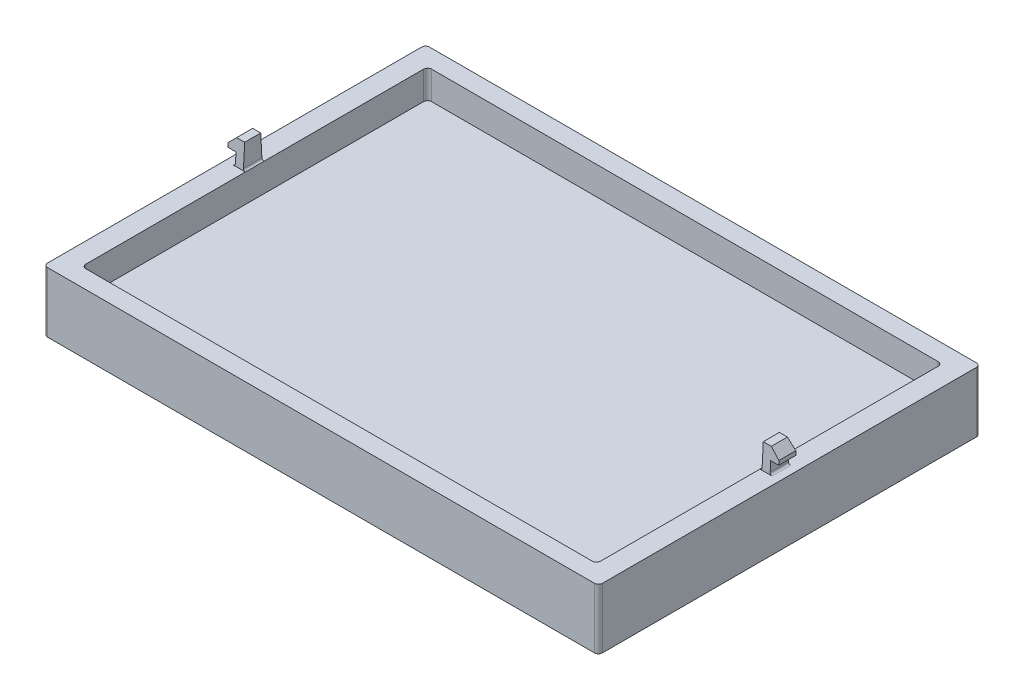
ISO-10303-21;
HEADER;
FILE_DESCRIPTION(('STEP AP214'),'2;1');
FILE_NAME('part.step','',(''),(''),'','','');
FILE_SCHEMA(('AUTOMOTIVE_DESIGN { 1 0 10303 214 1 1 1 1 }'));
ENDSEC;
DATA;
#1=APPLICATION_CONTEXT('core data for automotive mechanical design processes');
#2=APPLICATION_PROTOCOL_DEFINITION('international standard','automotive_design',2000,#1);
#3=PRODUCT_CONTEXT('',#1,'mechanical');
#4=PRODUCT('Part','Part','',(#3));
#5=PRODUCT_RELATED_PRODUCT_CATEGORY('part','',(#4));
#6=PRODUCT_DEFINITION_FORMATION('','',#4);
#7=PRODUCT_DEFINITION_CONTEXT('part definition',#1,'design');
#8=PRODUCT_DEFINITION('design','',#6,#7);
#9=PRODUCT_DEFINITION_SHAPE('','',#8);
#10=(LENGTH_UNIT() NAMED_UNIT(*) SI_UNIT(.MILLI.,.METRE.));
#11=(NAMED_UNIT(*) PLANE_ANGLE_UNIT() SI_UNIT($,.RADIAN.));
#12=(NAMED_UNIT(*) SI_UNIT($,.STERADIAN.) SOLID_ANGLE_UNIT());
#13=UNCERTAINTY_MEASURE_WITH_UNIT(LENGTH_MEASURE(1.E-05),#10,'distance_accuracy_value','');
#14=(GEOMETRIC_REPRESENTATION_CONTEXT(3) GLOBAL_UNCERTAINTY_ASSIGNED_CONTEXT((#13)) GLOBAL_UNIT_ASSIGNED_CONTEXT((#10,
#11,#12)) REPRESENTATION_CONTEXT('',''));
#15=CARTESIAN_POINT('',(0.,0.,0.));
#16=DIRECTION('',(0.,0.,1.));
#17=DIRECTION('',(1.,0.,0.));
#18=AXIS2_PLACEMENT_3D('',#15,#16,#17);
#19=CARTESIAN_POINT('',(-69.,15.,-47.5));
#20=DIRECTION('',(1.,0.,0.));
#21=DIRECTION('',(0.,0.,-1.));
#22=AXIS2_PLACEMENT_3D('',#19,#20,#21);
#23=PLANE('',#22);
#24=DIRECTION('',(0.,0.,1.));
#25=VECTOR('',#24,1.);
#26=CARTESIAN_POINT('',(-69.,15.,-47.5));
#27=LINE('',#26,#25);
#28=CARTESIAN_POINT('',(-69.,15.,-46.5));
#29=VERTEX_POINT('',#28);
#30=CARTESIAN_POINT('',(-69.,15.,46.5));
#31=VERTEX_POINT('',#30);
#32=EDGE_CURVE('E381',#29,#31,#27,.T.);
#33=ORIENTED_EDGE('',*,*,#32,.F.);
#34=DIRECTION('',(0.,-1.,0.));
#35=VECTOR('',#34,1.);
#36=CARTESIAN_POINT('',(-69.,0.,-46.5));
#37=LINE('',#36,#35);
#38=CARTESIAN_POINT('',(-69.,0.,-46.5));
#39=VERTEX_POINT('',#38);
#40=EDGE_CURVE('E465',#29,#39,#37,.T.);
#41=ORIENTED_EDGE('',*,*,#40,.T.);
#42=DIRECTION('',(0.,0.,1.));
#43=VECTOR('',#42,1.);
#44=CARTESIAN_POINT('',(-69.,0.,-47.5));
#45=LINE('',#44,#43);
#46=CARTESIAN_POINT('',(-69.,0.,46.5));
#47=VERTEX_POINT('',#46);
#48=EDGE_CURVE('E366',#39,#47,#45,.T.);
#49=ORIENTED_EDGE('',*,*,#48,.T.);
#50=DIRECTION('',(0.,-1.,0.));
#51=VECTOR('',#50,1.);
#52=CARTESIAN_POINT('',(-69.,15.,46.5));
#53=LINE('',#52,#51);
#54=EDGE_CURVE('E463',#47,#31,#53,.F.);
#55=ORIENTED_EDGE('',*,*,#54,.T.);
#56=EDGE_LOOP('',(#33,#41,#49,#55));
#57=FACE_BOUND('',#56,.T.);
#58=ADVANCED_FACE('F34',(#57),#23,.F.);
#59=CARTESIAN_POINT('',(-69.,15.,47.5));
#60=DIRECTION('',(0.,0.,-1.));
#61=DIRECTION('',(-1.,0.,0.));
#62=AXIS2_PLACEMENT_3D('',#59,#60,#61);
#63=PLANE('',#62);
#64=DIRECTION('',(1.,0.,0.));
#65=VECTOR('',#64,1.);
#66=CARTESIAN_POINT('',(-69.,0.,47.5));
#67=LINE('',#66,#65);
#68=CARTESIAN_POINT('',(-68.,0.,47.5));
#69=VERTEX_POINT('',#68);
#70=CARTESIAN_POINT('',(68.,0.,47.5));
#71=VERTEX_POINT('',#70);
#72=EDGE_CURVE('E397',#69,#71,#67,.T.);
#73=ORIENTED_EDGE('',*,*,#72,.T.);
#74=DIRECTION('',(0.,-1.,0.));
#75=VECTOR('',#74,1.);
#76=CARTESIAN_POINT('',(68.,15.,47.5));
#77=LINE('',#76,#75);
#78=CARTESIAN_POINT('',(68.,15.,47.5));
#79=VERTEX_POINT('',#78);
#80=EDGE_CURVE('E448',#71,#79,#77,.F.);
#81=ORIENTED_EDGE('',*,*,#80,.T.);
#82=DIRECTION('',(1.,0.,0.));
#83=VECTOR('',#82,1.);
#84=CARTESIAN_POINT('',(-69.,15.,47.5));
#85=LINE('',#84,#83);
#86=CARTESIAN_POINT('',(-68.,15.,47.5));
#87=VERTEX_POINT('',#86);
#88=EDGE_CURVE('E384',#87,#79,#85,.T.);
#89=ORIENTED_EDGE('',*,*,#88,.F.);
#90=DIRECTION('',(0.,-1.,0.));
#91=VECTOR('',#90,1.);
#92=CARTESIAN_POINT('',(-68.,15.,47.5));
#93=LINE('',#92,#91);
#94=EDGE_CURVE('E445',#87,#69,#93,.T.);
#95=ORIENTED_EDGE('',*,*,#94,.T.);
#96=EDGE_LOOP('',(#73,#81,#89,#95));
#97=FACE_BOUND('',#96,.T.);
#98=ADVANCED_FACE('F605',(#97),#63,.F.);
#99=CARTESIAN_POINT('',(69.,15.,-47.5));
#100=DIRECTION('',(1.,0.,0.));
#101=DIRECTION('',(0.,0.,-1.));
#102=AXIS2_PLACEMENT_3D('',#99,#100,#101);
#103=PLANE('',#102);
#104=DIRECTION('',(0.,0.,1.));
#105=VECTOR('',#104,1.);
#106=CARTESIAN_POINT('',(69.,15.,-47.5));
#107=LINE('',#106,#105);
#108=CARTESIAN_POINT('',(69.,15.,-46.5));
#109=VERTEX_POINT('',#108);
#110=CARTESIAN_POINT('',(69.,15.,46.5));
#111=VERTEX_POINT('',#110);
#112=EDGE_CURVE('E388',#109,#111,#107,.T.);
#113=ORIENTED_EDGE('',*,*,#112,.T.);
#114=DIRECTION('',(0.,-1.,0.));
#115=VECTOR('',#114,1.);
#116=CARTESIAN_POINT('',(69.,0.,46.5));
#117=LINE('',#116,#115);
#118=CARTESIAN_POINT('',(69.,0.,46.5));
#119=VERTEX_POINT('',#118);
#120=EDGE_CURVE('E434',#111,#119,#117,.T.);
#121=ORIENTED_EDGE('',*,*,#120,.T.);
#122=DIRECTION('',(0.,0.,1.));
#123=VECTOR('',#122,1.);
#124=CARTESIAN_POINT('',(69.,0.,-47.5));
#125=LINE('',#124,#123);
#126=CARTESIAN_POINT('',(69.,0.,-46.5));
#127=VERTEX_POINT('',#126);
#128=EDGE_CURVE('E400',#127,#119,#125,.T.);
#129=ORIENTED_EDGE('',*,*,#128,.F.);
#130=DIRECTION('',(0.,-1.,0.));
#131=VECTOR('',#130,1.);
#132=CARTESIAN_POINT('',(69.,15.,-46.5));
#133=LINE('',#132,#131);
#134=EDGE_CURVE('E432',#127,#109,#133,.F.);
#135=ORIENTED_EDGE('',*,*,#134,.T.);
#136=EDGE_LOOP('',(#113,#121,#129,#135));
#137=FACE_BOUND('',#136,.T.);
#138=ADVANCED_FACE('F611',(#137),#103,.T.);
#139=CARTESIAN_POINT('',(-69.,15.,-47.5));
#140=DIRECTION('',(0.,0.,-1.));
#141=DIRECTION('',(-1.,0.,0.));
#142=AXIS2_PLACEMENT_3D('',#139,#140,#141);
#143=PLANE('',#142);
#144=DIRECTION('',(1.,0.,0.));
#145=VECTOR('',#144,1.);
#146=CARTESIAN_POINT('',(-69.,15.,-47.5));
#147=LINE('',#146,#145);
#148=CARTESIAN_POINT('',(-68.,15.,-47.5));
#149=VERTEX_POINT('',#148);
#150=CARTESIAN_POINT('',(68.,15.,-47.5));
#151=VERTEX_POINT('',#150);
#152=EDGE_CURVE('E391',#149,#151,#147,.T.);
#153=ORIENTED_EDGE('',*,*,#152,.T.);
#154=DIRECTION('',(0.,-1.,0.));
#155=VECTOR('',#154,1.);
#156=CARTESIAN_POINT('',(68.,15.,-47.5));
#157=LINE('',#156,#155);
#158=CARTESIAN_POINT('',(68.,0.,-47.5));
#159=VERTEX_POINT('',#158);
#160=EDGE_CURVE('E460',#151,#159,#157,.T.);
#161=ORIENTED_EDGE('',*,*,#160,.T.);
#162=DIRECTION('',(1.,0.,0.));
#163=VECTOR('',#162,1.);
#164=CARTESIAN_POINT('',(-69.,0.,-47.5));
#165=LINE('',#164,#163);
#166=CARTESIAN_POINT('',(-68.,0.,-47.5));
#167=VERTEX_POINT('',#166);
#168=EDGE_CURVE('E385',#167,#159,#165,.T.);
#169=ORIENTED_EDGE('',*,*,#168,.F.);
#170=DIRECTION('',(0.,-1.,0.));
#171=VECTOR('',#170,1.);
#172=CARTESIAN_POINT('',(-68.,15.,-47.5));
#173=LINE('',#172,#171);
#174=EDGE_CURVE('E458',#167,#149,#173,.F.);
#175=ORIENTED_EDGE('',*,*,#174,.T.);
#176=EDGE_LOOP('',(#153,#161,#169,#175));
#177=FACE_BOUND('',#176,.T.);
#178=ADVANCED_FACE('F708',(#177),#143,.T.);
#179=CARTESIAN_POINT('',(0.,15.,0.));
#180=DIRECTION('',(0.,1.,0.));
#181=DIRECTION('',(0.,0.,1.));
#182=AXIS2_PLACEMENT_3D('',#179,#180,#181);
#183=PLANE('',#182);
#184=DIRECTION('',(0.,0.,1.));
#185=VECTOR('',#184,1.);
#186=CARTESIAN_POINT('',(-64.,15.,-43.));
#187=LINE('',#186,#185);
#188=CARTESIAN_POINT('',(-64.,15.,2.31444667569825));
#189=VERTEX_POINT('',#188);
#190=CARTESIAN_POINT('',(-64.,15.,42.));
#191=VERTEX_POINT('',#190);
#192=EDGE_CURVE('E374',#189,#191,#187,.T.);
#193=ORIENTED_EDGE('',*,*,#192,.F.);
#194=DIRECTION('',(-1.,0.,0.));
#195=VECTOR('',#194,1.);
#196=CARTESIAN_POINT('',(-64.5,15.,2.31444667569824));
#197=LINE('',#196,#195);
#198=CARTESIAN_POINT('',(-67.,15.,2.31444667569824));
#199=VERTEX_POINT('',#198);
#200=EDGE_CURVE('E295',#189,#199,#197,.T.);
#201=ORIENTED_EDGE('',*,*,#200,.T.);
#202=DIRECTION('',(0.,0.,-1.));
#203=VECTOR('',#202,1.);
#204=CARTESIAN_POINT('',(-67.,15.,-2.31444667569825));
#205=LINE('',#204,#203);
#206=CARTESIAN_POINT('',(-67.,15.,-2.31444667569825));
#207=VERTEX_POINT('',#206);
#208=EDGE_CURVE('E481',#199,#207,#205,.T.);
#209=ORIENTED_EDGE('',*,*,#208,.T.);
#210=DIRECTION('',(1.,0.,0.));
#211=VECTOR('',#210,1.);
#212=CARTESIAN_POINT('',(-64.5,15.,-2.31444667569825));
#213=LINE('',#212,#211);
#214=CARTESIAN_POINT('',(-64.,15.,-2.31444667569825));
#215=VERTEX_POINT('',#214);
#216=EDGE_CURVE('E274',#207,#215,#213,.T.);
#217=ORIENTED_EDGE('',*,*,#216,.T.);
#218=CARTESIAN_POINT('',(-64.,15.,-42.));
#219=VERTEX_POINT('',#218);
#220=EDGE_CURVE('E375',#219,#215,#187,.T.);
#221=ORIENTED_EDGE('',*,*,#220,.F.);
#222=CARTESIAN_POINT('',(-63.,15.,-42.));
#223=DIRECTION('',(0.,1.,0.));
#224=DIRECTION('',(0.,0.,1.));
#225=AXIS2_PLACEMENT_3D('',#222,#223,#224);
#226=CIRCLE('',#225,1.);
#227=CARTESIAN_POINT('',(-63.,15.,-43.));
#228=VERTEX_POINT('',#227);
#229=EDGE_CURVE('E471',#219,#228,#226,.F.);
#230=ORIENTED_EDGE('',*,*,#229,.T.);
#231=DIRECTION('',(-1.,0.,0.));
#232=VECTOR('',#231,1.);
#233=CARTESIAN_POINT('',(-64.,15.,-43.));
#234=LINE('',#233,#232);
#235=CARTESIAN_POINT('',(63.,15.,-43.));
#236=VERTEX_POINT('',#235);
#237=EDGE_CURVE('E370',#236,#228,#234,.T.);
#238=ORIENTED_EDGE('',*,*,#237,.F.);
#239=CARTESIAN_POINT('',(63.,15.,-42.));
#240=DIRECTION('',(0.,1.,0.));
#241=DIRECTION('',(0.,0.,1.));
#242=AXIS2_PLACEMENT_3D('',#239,#240,#241);
#243=CIRCLE('',#242,1.);
#244=CARTESIAN_POINT('',(64.,15.,-42.));
#245=VERTEX_POINT('',#244);
#246=EDGE_CURVE('E473',#236,#245,#243,.F.);
#247=ORIENTED_EDGE('',*,*,#246,.T.);
#248=DIRECTION('',(0.,0.,-1.));
#249=VECTOR('',#248,1.);
#250=CARTESIAN_POINT('',(64.,15.,-43.));
#251=LINE('',#250,#249);
#252=CARTESIAN_POINT('',(64.,15.,-2.31444667569825));
#253=VERTEX_POINT('',#252);
#254=EDGE_CURVE('E309',#253,#245,#251,.T.);
#255=ORIENTED_EDGE('',*,*,#254,.F.);
#256=DIRECTION('',(1.,0.,0.));
#257=VECTOR('',#256,1.);
#258=CARTESIAN_POINT('',(64.5,15.,-2.31444667569825));
#259=LINE('',#258,#257);
#260=CARTESIAN_POINT('',(67.,15.,-2.31444667569825));
#261=VERTEX_POINT('',#260);
#262=EDGE_CURVE('E307',#253,#261,#259,.T.);
#263=ORIENTED_EDGE('',*,*,#262,.T.);
#264=DIRECTION('',(0.,0.,1.));
#265=VECTOR('',#264,1.);
#266=CARTESIAN_POINT('',(67.,15.,2.31444667569824));
#267=LINE('',#266,#265);
#268=CARTESIAN_POINT('',(67.,15.,2.31444667569824));
#269=VERTEX_POINT('',#268);
#270=EDGE_CURVE('E478',#261,#269,#267,.T.);
#271=ORIENTED_EDGE('',*,*,#270,.T.);
#272=DIRECTION('',(-1.,0.,0.));
#273=VECTOR('',#272,1.);
#274=CARTESIAN_POINT('',(64.5,15.,2.31444667569824));
#275=LINE('',#274,#273);
#276=CARTESIAN_POINT('',(64.,15.,2.31444667569825));
#277=VERTEX_POINT('',#276);
#278=EDGE_CURVE('E310',#269,#277,#275,.T.);
#279=ORIENTED_EDGE('',*,*,#278,.T.);
#280=CARTESIAN_POINT('',(64.,15.,42.));
#281=VERTEX_POINT('',#280);
#282=EDGE_CURVE('E367',#281,#277,#251,.T.);
#283=ORIENTED_EDGE('',*,*,#282,.F.);
#284=CARTESIAN_POINT('',(63.,15.,42.));
#285=DIRECTION('',(0.,1.,0.));
#286=DIRECTION('',(0.,0.,1.));
#287=AXIS2_PLACEMENT_3D('',#284,#285,#286);
#288=CIRCLE('',#287,1.);
#289=CARTESIAN_POINT('',(63.,15.,43.));
#290=VERTEX_POINT('',#289);
#291=EDGE_CURVE('E476',#281,#290,#288,.F.);
#292=ORIENTED_EDGE('',*,*,#291,.T.);
#293=DIRECTION('',(1.,0.,0.));
#294=VECTOR('',#293,1.);
#295=CARTESIAN_POINT('',(-64.,15.,43.));
#296=LINE('',#295,#294);
#297=CARTESIAN_POINT('',(-63.,15.,43.));
#298=VERTEX_POINT('',#297);
#299=EDGE_CURVE('E357',#298,#290,#296,.T.);
#300=ORIENTED_EDGE('',*,*,#299,.F.);
#301=CARTESIAN_POINT('',(-63.,15.,42.));
#302=DIRECTION('',(0.,1.,0.));
#303=DIRECTION('',(0.,0.,1.));
#304=AXIS2_PLACEMENT_3D('',#301,#302,#303);
#305=CIRCLE('',#304,1.);
#306=EDGE_CURVE('E468',#298,#191,#305,.F.);
#307=ORIENTED_EDGE('',*,*,#306,.T.);
#308=EDGE_LOOP('',(#193,#201,#209,#217,#221,#230,#238,#247,#255,#263,#271,#279,#283,#292,#300,#307));
#309=FACE_BOUND('',#308,.T.);
#310=ORIENTED_EDGE('',*,*,#88,.T.);
#311=CARTESIAN_POINT('',(68.,15.,46.5));
#312=DIRECTION('',(0.,1.,0.));
#313=DIRECTION('',(0.,0.,1.));
#314=AXIS2_PLACEMENT_3D('',#311,#312,#313);
#315=CIRCLE('',#314,1.);
#316=EDGE_CURVE('E456',#79,#111,#315,.T.);
#317=ORIENTED_EDGE('',*,*,#316,.T.);
#318=ORIENTED_EDGE('',*,*,#112,.F.);
#319=CARTESIAN_POINT('',(68.,15.,-46.5));
#320=DIRECTION('',(0.,1.,0.));
#321=DIRECTION('',(0.,0.,1.));
#322=AXIS2_PLACEMENT_3D('',#319,#320,#321);
#323=CIRCLE('',#322,1.);
#324=EDGE_CURVE('E454',#109,#151,#323,.T.);
#325=ORIENTED_EDGE('',*,*,#324,.T.);
#326=ORIENTED_EDGE('',*,*,#152,.F.);
#327=CARTESIAN_POINT('',(-68.,15.,-46.5));
#328=DIRECTION('',(0.,1.,0.));
#329=DIRECTION('',(0.,0.,1.));
#330=AXIS2_PLACEMENT_3D('',#327,#328,#329);
#331=CIRCLE('',#330,1.);
#332=EDGE_CURVE('E452',#149,#29,#331,.T.);
#333=ORIENTED_EDGE('',*,*,#332,.T.);
#334=ORIENTED_EDGE('',*,*,#32,.T.);
#335=CARTESIAN_POINT('',(-68.,15.,46.5));
#336=DIRECTION('',(0.,1.,0.));
#337=DIRECTION('',(0.,0.,1.));
#338=AXIS2_PLACEMENT_3D('',#335,#336,#337);
#339=CIRCLE('',#338,1.);
#340=EDGE_CURVE('E450',#31,#87,#339,.T.);
#341=ORIENTED_EDGE('',*,*,#340,.T.);
#342=EDGE_LOOP('',(#310,#317,#318,#325,#326,#333,#334,#341));
#343=FACE_BOUND('',#342,.T.);
#344=ADVANCED_FACE('F524',(#309,#343),#183,.T.);
#345=CARTESIAN_POINT('',(0.,0.,0.));
#346=DIRECTION('',(0.,1.,0.));
#347=DIRECTION('',(0.,0.,1.));
#348=AXIS2_PLACEMENT_3D('',#345,#346,#347);
#349=PLANE('',#348);
#350=ORIENTED_EDGE('',*,*,#128,.T.);
#351=CARTESIAN_POINT('',(68.,0.,46.5));
#352=DIRECTION('',(0.,1.,0.));
#353=DIRECTION('',(0.,0.,1.));
#354=AXIS2_PLACEMENT_3D('',#351,#352,#353);
#355=CIRCLE('',#354,1.);
#356=EDGE_CURVE('E443',#119,#71,#355,.F.);
#357=ORIENTED_EDGE('',*,*,#356,.T.);
#358=ORIENTED_EDGE('',*,*,#72,.F.);
#359=CARTESIAN_POINT('',(-68.,0.,46.5));
#360=DIRECTION('',(0.,1.,0.));
#361=DIRECTION('',(0.,0.,1.));
#362=AXIS2_PLACEMENT_3D('',#359,#360,#361);
#363=CIRCLE('',#362,1.);
#364=EDGE_CURVE('E437',#69,#47,#363,.F.);
#365=ORIENTED_EDGE('',*,*,#364,.T.);
#366=ORIENTED_EDGE('',*,*,#48,.F.);
#367=CARTESIAN_POINT('',(-68.,0.,-46.5));
#368=DIRECTION('',(0.,1.,0.));
#369=DIRECTION('',(0.,0.,1.));
#370=AXIS2_PLACEMENT_3D('',#367,#368,#369);
#371=CIRCLE('',#370,1.);
#372=EDGE_CURVE('E439',#39,#167,#371,.F.);
#373=ORIENTED_EDGE('',*,*,#372,.T.);
#374=ORIENTED_EDGE('',*,*,#168,.T.);
#375=CARTESIAN_POINT('',(68.,0.,-46.5));
#376=DIRECTION('',(0.,1.,0.));
#377=DIRECTION('',(0.,0.,1.));
#378=AXIS2_PLACEMENT_3D('',#375,#376,#377);
#379=CIRCLE('',#378,1.);
#380=EDGE_CURVE('E441',#159,#127,#379,.F.);
#381=ORIENTED_EDGE('',*,*,#380,.T.);
#382=EDGE_LOOP('',(#350,#357,#358,#365,#366,#373,#374,#381));
#383=FACE_BOUND('',#382,.T.);
#384=ADVANCED_FACE('F705',(#383),#349,.F.);
#385=CARTESIAN_POINT('',(64.,8.,-43.));
#386=DIRECTION('',(1.,0.,0.));
#387=DIRECTION('',(0.,0.,-1.));
#388=AXIS2_PLACEMENT_3D('',#385,#386,#387);
#389=PLANE('',#388);
#390=ORIENTED_EDGE('',*,*,#282,.T.);
#391=EDGE_CURVE('E371',#277,#253,#251,.T.);
#392=ORIENTED_EDGE('',*,*,#391,.T.);
#393=ORIENTED_EDGE('',*,*,#254,.T.);
#394=DIRECTION('',(0.,1.,0.));
#395=VECTOR('',#394,1.);
#396=CARTESIAN_POINT('',(64.,8.,-42.));
#397=LINE('',#396,#395);
#398=CARTESIAN_POINT('',(64.,8.,-42.));
#399=VERTEX_POINT('',#398);
#400=EDGE_CURVE('E430',#245,#399,#397,.F.);
#401=ORIENTED_EDGE('',*,*,#400,.T.);
#402=DIRECTION('',(0.,0.,-1.));
#403=VECTOR('',#402,1.);
#404=CARTESIAN_POINT('',(64.,8.,-43.));
#405=LINE('',#404,#403);
#406=CARTESIAN_POINT('',(64.,8.,42.));
#407=VERTEX_POINT('',#406);
#408=EDGE_CURVE('E353',#407,#399,#405,.T.);
#409=ORIENTED_EDGE('',*,*,#408,.F.);
#410=DIRECTION('',(0.,1.,0.));
#411=VECTOR('',#410,1.);
#412=CARTESIAN_POINT('',(64.,15.,42.));
#413=LINE('',#412,#411);
#414=EDGE_CURVE('E427',#407,#281,#413,.T.);
#415=ORIENTED_EDGE('',*,*,#414,.T.);
#416=EDGE_LOOP('',(#390,#392,#393,#401,#409,#415));
#417=FACE_BOUND('',#416,.T.);
#418=ADVANCED_FACE('F514',(#417),#389,.F.);
#419=CARTESIAN_POINT('',(-64.,8.,43.));
#420=DIRECTION('',(0.,0.,1.));
#421=DIRECTION('',(1.,0.,0.));
#422=AXIS2_PLACEMENT_3D('',#419,#420,#421);
#423=PLANE('',#422);
#424=DIRECTION('',(1.,0.,0.));
#425=VECTOR('',#424,1.);
#426=CARTESIAN_POINT('',(-64.,8.,43.));
#427=LINE('',#426,#425);
#428=CARTESIAN_POINT('',(-63.,8.,43.));
#429=VERTEX_POINT('',#428);
#430=CARTESIAN_POINT('',(63.,8.,43.));
#431=VERTEX_POINT('',#430);
#432=EDGE_CURVE('E363',#429,#431,#427,.T.);
#433=ORIENTED_EDGE('',*,*,#432,.F.);
#434=DIRECTION('',(0.,1.,0.));
#435=VECTOR('',#434,1.);
#436=CARTESIAN_POINT('',(-63.,15.,43.));
#437=LINE('',#436,#435);
#438=EDGE_CURVE('E406',#429,#298,#437,.T.);
#439=ORIENTED_EDGE('',*,*,#438,.T.);
#440=ORIENTED_EDGE('',*,*,#299,.T.);
#441=DIRECTION('',(0.,1.,0.));
#442=VECTOR('',#441,1.);
#443=CARTESIAN_POINT('',(63.,8.,43.));
#444=LINE('',#443,#442);
#445=EDGE_CURVE('E394',#290,#431,#444,.F.);
#446=ORIENTED_EDGE('',*,*,#445,.T.);
#447=EDGE_LOOP('',(#433,#439,#440,#446));
#448=FACE_BOUND('',#447,.T.);
#449=ADVANCED_FACE('F553',(#448),#423,.F.);
#450=CARTESIAN_POINT('',(-64.,8.,-43.));
#451=DIRECTION('',(-1.,0.,0.));
#452=DIRECTION('',(0.,0.,1.));
#453=AXIS2_PLACEMENT_3D('',#450,#451,#452);
#454=PLANE('',#453);
#455=ORIENTED_EDGE('',*,*,#220,.T.);
#456=EDGE_CURVE('E378',#215,#189,#187,.T.);
#457=ORIENTED_EDGE('',*,*,#456,.T.);
#458=ORIENTED_EDGE('',*,*,#192,.T.);
#459=DIRECTION('',(0.,1.,0.));
#460=VECTOR('',#459,1.);
#461=CARTESIAN_POINT('',(-64.,8.,42.));
#462=LINE('',#461,#460);
#463=CARTESIAN_POINT('',(-64.,8.,42.));
#464=VERTEX_POINT('',#463);
#465=EDGE_CURVE('E412',#191,#464,#462,.F.);
#466=ORIENTED_EDGE('',*,*,#465,.T.);
#467=DIRECTION('',(0.,0.,1.));
#468=VECTOR('',#467,1.);
#469=CARTESIAN_POINT('',(-64.,8.,-43.));
#470=LINE('',#469,#468);
#471=CARTESIAN_POINT('',(-64.,8.,-42.));
#472=VERTEX_POINT('',#471);
#473=EDGE_CURVE('E360',#472,#464,#470,.T.);
#474=ORIENTED_EDGE('',*,*,#473,.F.);
#475=DIRECTION('',(0.,1.,0.));
#476=VECTOR('',#475,1.);
#477=CARTESIAN_POINT('',(-64.,15.,-42.));
#478=LINE('',#477,#476);
#479=EDGE_CURVE('E409',#472,#219,#478,.T.);
#480=ORIENTED_EDGE('',*,*,#479,.T.);
#481=EDGE_LOOP('',(#455,#457,#458,#466,#474,#480));
#482=FACE_BOUND('',#481,.T.);
#483=ADVANCED_FACE('F543',(#482),#454,.F.);
#484=CARTESIAN_POINT('',(-64.,8.,-43.));
#485=DIRECTION('',(0.,0.,-1.));
#486=DIRECTION('',(-1.,0.,0.));
#487=AXIS2_PLACEMENT_3D('',#484,#485,#486);
#488=PLANE('',#487);
#489=ORIENTED_EDGE('',*,*,#237,.T.);
#490=DIRECTION('',(0.,1.,0.));
#491=VECTOR('',#490,1.);
#492=CARTESIAN_POINT('',(-63.,8.,-43.));
#493=LINE('',#492,#491);
#494=CARTESIAN_POINT('',(-63.,8.,-43.));
#495=VERTEX_POINT('',#494);
#496=EDGE_CURVE('E425',#228,#495,#493,.F.);
#497=ORIENTED_EDGE('',*,*,#496,.T.);
#498=DIRECTION('',(-1.,0.,0.));
#499=VECTOR('',#498,1.);
#500=CARTESIAN_POINT('',(-64.,8.,-43.));
#501=LINE('',#500,#499);
#502=CARTESIAN_POINT('',(63.,8.,-43.));
#503=VERTEX_POINT('',#502);
#504=EDGE_CURVE('E356',#503,#495,#501,.T.);
#505=ORIENTED_EDGE('',*,*,#504,.F.);
#506=DIRECTION('',(0.,1.,0.));
#507=VECTOR('',#506,1.);
#508=CARTESIAN_POINT('',(63.,15.,-43.));
#509=LINE('',#508,#507);
#510=EDGE_CURVE('E422',#503,#236,#509,.T.);
#511=ORIENTED_EDGE('',*,*,#510,.T.);
#512=EDGE_LOOP('',(#489,#497,#505,#511));
#513=FACE_BOUND('',#512,.T.);
#514=ADVANCED_FACE('F535',(#513),#488,.F.);
#515=CARTESIAN_POINT('',(0.,8.,0.));
#516=DIRECTION('',(0.,1.,0.));
#517=DIRECTION('',(0.,0.,1.));
#518=AXIS2_PLACEMENT_3D('',#515,#516,#517);
#519=PLANE('',#518);
#520=ORIENTED_EDGE('',*,*,#473,.T.);
#521=CARTESIAN_POINT('',(-63.,8.,42.));
#522=DIRECTION('',(0.,1.,0.));
#523=DIRECTION('',(0.,0.,1.));
#524=AXIS2_PLACEMENT_3D('',#521,#522,#523);
#525=CIRCLE('',#524,1.);
#526=EDGE_CURVE('E420',#464,#429,#525,.T.);
#527=ORIENTED_EDGE('',*,*,#526,.T.);
#528=ORIENTED_EDGE('',*,*,#432,.T.);
#529=CARTESIAN_POINT('',(63.,8.,42.));
#530=DIRECTION('',(0.,1.,0.));
#531=DIRECTION('',(0.,0.,1.));
#532=AXIS2_PLACEMENT_3D('',#529,#530,#531);
#533=CIRCLE('',#532,1.);
#534=EDGE_CURVE('E414',#431,#407,#533,.T.);
#535=ORIENTED_EDGE('',*,*,#534,.T.);
#536=ORIENTED_EDGE('',*,*,#408,.T.);
#537=CARTESIAN_POINT('',(63.,8.,-42.));
#538=DIRECTION('',(0.,1.,0.));
#539=DIRECTION('',(0.,0.,1.));
#540=AXIS2_PLACEMENT_3D('',#537,#538,#539);
#541=CIRCLE('',#540,1.);
#542=EDGE_CURVE('E416',#399,#503,#541,.T.);
#543=ORIENTED_EDGE('',*,*,#542,.T.);
#544=ORIENTED_EDGE('',*,*,#504,.T.);
#545=CARTESIAN_POINT('',(-63.,8.,-42.));
#546=DIRECTION('',(0.,1.,0.));
#547=DIRECTION('',(0.,0.,1.));
#548=AXIS2_PLACEMENT_3D('',#545,#546,#547);
#549=CIRCLE('',#548,1.);
#550=EDGE_CURVE('E418',#495,#472,#549,.T.);
#551=ORIENTED_EDGE('',*,*,#550,.T.);
#552=EDGE_LOOP('',(#520,#527,#528,#535,#536,#543,#544,#551));
#553=FACE_BOUND('',#552,.T.);
#554=ADVANCED_FACE('F532',(#553),#519,.T.);
#555=CARTESIAN_POINT('',(66.5,-482.,0.));
#556=DIRECTION('',(1.,0.,0.));
#557=DIRECTION('',(0.,0.,-1.));
#558=AXIS2_PLACEMENT_3D('',#555,#556,#557);
#559=PLANE('',#558);
#560=DIRECTION('',(0.,0.998629534754574,-0.0523359562429438));
#561=VECTOR('',#560,1.);
#562=CARTESIAN_POINT('',(66.5,21.,2.));
#563=LINE('',#562,#561);
#564=CARTESIAN_POINT('',(66.5,15.5,2.28824278605672));
#565=VERTEX_POINT('',#564);
#566=CARTESIAN_POINT('',(66.5,18.,2.15722333784912));
#567=VERTEX_POINT('',#566);
#568=EDGE_CURVE('E297',#565,#567,#563,.T.);
#569=ORIENTED_EDGE('',*,*,#568,.F.);
#570=DIRECTION('',(0.,0.,1.));
#571=VECTOR('',#570,1.);
#572=CARTESIAN_POINT('',(66.5,15.5,-2.31444667569825));
#573=LINE('',#572,#571);
#574=CARTESIAN_POINT('',(66.5,15.5,-2.28824278605673));
#575=VERTEX_POINT('',#574);
#576=EDGE_CURVE('E55',#565,#575,#573,.F.);
#577=ORIENTED_EDGE('',*,*,#576,.T.);
#578=DIRECTION('',(0.,-0.998629534754574,-0.0523359562429438));
#579=VECTOR('',#578,1.);
#580=CARTESIAN_POINT('',(66.5,21.,-2.));
#581=LINE('',#580,#579);
#582=CARTESIAN_POINT('',(66.5,18.,-2.15722333784913));
#583=VERTEX_POINT('',#582);
#584=EDGE_CURVE('E327',#583,#575,#581,.T.);
#585=ORIENTED_EDGE('',*,*,#584,.F.);
#586=DIRECTION('',(0.,0.,-1.));
#587=VECTOR('',#586,1.);
#588=CARTESIAN_POINT('',(66.5,18.,0.));
#589=LINE('',#588,#587);
#590=EDGE_CURVE('E319',#567,#583,#589,.T.);
#591=ORIENTED_EDGE('',*,*,#590,.F.);
#592=EDGE_LOOP('',(#569,#577,#585,#591));
#593=FACE_BOUND('',#592,.T.);
#594=ADVANCED_FACE('F659',(#593),#559,.T.);
#595=CARTESIAN_POINT('',(64.5,21.,2.));
#596=DIRECTION('',(0.,0.0523359562429438,0.998629534754574));
#597=DIRECTION('',(0.,-0.998629534754574,0.0523359562429438));
#598=AXIS2_PLACEMENT_3D('',#595,#596,#597);
#599=PLANE('',#598);
#600=ORIENTED_EDGE('',*,*,#278,.F.);
#601=CARTESIAN_POINT('',(67.,15.5,2.28824278605672));
#602=DIRECTION('',(0.,0.0523359562429438,0.998629534754574));
#603=DIRECTION('',(0.,0.998629534754574,-0.0523359562429438));
#604=AXIS2_PLACEMENT_3D('',#601,#602,#603);
#605=ELLIPSE('',#604,0.50068617299896,0.5);
#606=EDGE_CURVE('E42',#269,#565,#605,.F.);
#607=ORIENTED_EDGE('',*,*,#606,.T.);
#608=ORIENTED_EDGE('',*,*,#568,.T.);
#609=DIRECTION('',(1.,0.,0.));
#610=VECTOR('',#609,1.);
#611=CARTESIAN_POINT('',(64.5,18.,2.15722333784912));
#612=LINE('',#611,#610);
#613=CARTESIAN_POINT('',(68.5,18.,2.15722333784912));
#614=VERTEX_POINT('',#613);
#615=EDGE_CURVE('E320',#567,#614,#612,.T.);
#616=ORIENTED_EDGE('',*,*,#615,.T.);
#617=DIRECTION('',(0.,-0.998629534754574,0.0523359562429438));
#618=VECTOR('',#617,1.);
#619=CARTESIAN_POINT('',(68.5,21.,2.));
#620=LINE('',#619,#618);
#621=CARTESIAN_POINT('',(68.5,19.,2.10481555856608));
#622=VERTEX_POINT('',#621);
#623=EDGE_CURVE('E314',#622,#614,#620,.T.);
#624=ORIENTED_EDGE('',*,*,#623,.F.);
#625=DIRECTION('',(-0.706621750184623,0.706621750184624,-0.0370324767202719));
#626=VECTOR('',#625,1.);
#627=CARTESIAN_POINT('',(65.501371404332,21.998628595668,1.9476640929725));
#628=LINE('',#627,#626);
#629=CARTESIAN_POINT('',(66.5,21.,2.));
#630=VERTEX_POINT('',#629);
#631=EDGE_CURVE('E323',#622,#630,#628,.T.);
#632=ORIENTED_EDGE('',*,*,#631,.T.);
#633=DIRECTION('',(1.,0.,0.));
#634=VECTOR('',#633,1.);
#635=CARTESIAN_POINT('',(64.5,21.,2.));
#636=LINE('',#635,#634);
#637=CARTESIAN_POINT('',(64.5,21.,2.));
#638=VERTEX_POINT('',#637);
#639=EDGE_CURVE('E335',#638,#630,#636,.T.);
#640=ORIENTED_EDGE('',*,*,#639,.F.);
#641=DIRECTION('',(0.,-0.998629534754574,0.0523359562429438));
#642=VECTOR('',#641,1.);
#643=CARTESIAN_POINT('',(64.5,21.,2.));
#644=LINE('',#643,#642);
#645=CARTESIAN_POINT('',(64.5,15.5,2.28824278605672));
#646=VERTEX_POINT('',#645);
#647=EDGE_CURVE('E330',#638,#646,#644,.T.);
#648=ORIENTED_EDGE('',*,*,#647,.T.);
#649=CARTESIAN_POINT('',(64.,15.5,2.28824278605672));
#650=DIRECTION('',(0.,0.0523359562429438,0.998629534754574));
#651=DIRECTION('',(0.,-0.998629534754574,0.0523359562429438));
#652=AXIS2_PLACEMENT_3D('',#649,#650,#651);
#653=ELLIPSE('',#652,0.50068617299896,0.5);
#654=EDGE_CURVE('E503',#646,#277,#653,.F.);
#655=ORIENTED_EDGE('',*,*,#654,.T.);
#656=EDGE_LOOP('',(#600,#607,#608,#616,#624,#632,#640,#648,#655));
#657=FACE_BOUND('',#656,.T.);
#658=ADVANCED_FACE('F506',(#657),#599,.T.);
#659=CARTESIAN_POINT('',(64.5,21.,0.));
#660=DIRECTION('',(0.,1.,0.));
#661=DIRECTION('',(1.,0.,0.));
#662=AXIS2_PLACEMENT_3D('',#659,#660,#661);
#663=PLANE('',#662);
#664=ORIENTED_EDGE('',*,*,#639,.T.);
#665=DIRECTION('',(0.,0.,-1.));
#666=VECTOR('',#665,1.);
#667=CARTESIAN_POINT('',(66.5,21.,0.));
#668=LINE('',#667,#666);
#669=CARTESIAN_POINT('',(66.5,21.,-2.));
#670=VERTEX_POINT('',#669);
#671=EDGE_CURVE('E331',#630,#670,#668,.T.);
#672=ORIENTED_EDGE('',*,*,#671,.T.);
#673=DIRECTION('',(1.,0.,0.));
#674=VECTOR('',#673,1.);
#675=CARTESIAN_POINT('',(64.5,21.,-2.));
#676=LINE('',#675,#674);
#677=CARTESIAN_POINT('',(64.5,21.,-2.));
#678=VERTEX_POINT('',#677);
#679=EDGE_CURVE('E328',#678,#670,#676,.T.);
#680=ORIENTED_EDGE('',*,*,#679,.F.);
#681=DIRECTION('',(0.,0.,1.));
#682=VECTOR('',#681,1.);
#683=CARTESIAN_POINT('',(64.5,21.,0.));
#684=LINE('',#683,#682);
#685=EDGE_CURVE('E334',#678,#638,#684,.T.);
#686=ORIENTED_EDGE('',*,*,#685,.T.);
#687=EDGE_LOOP('',(#664,#672,#680,#686));
#688=FACE_BOUND('',#687,.T.);
#689=ADVANCED_FACE('F673',(#688),#663,.T.);
#690=CARTESIAN_POINT('',(64.5,21.,0.));
#691=DIRECTION('',(-1.,0.,0.));
#692=DIRECTION('',(0.,0.,1.));
#693=AXIS2_PLACEMENT_3D('',#690,#691,#692);
#694=PLANE('',#693);
#695=DIRECTION('',(0.,0.998629534754574,0.0523359562429438));
#696=VECTOR('',#695,1.);
#697=CARTESIAN_POINT('',(64.5,21.,-2.));
#698=LINE('',#697,#696);
#699=CARTESIAN_POINT('',(64.5,15.5,-2.28824278605673));
#700=VERTEX_POINT('',#699);
#701=EDGE_CURVE('E340',#700,#678,#698,.T.);
#702=ORIENTED_EDGE('',*,*,#701,.F.);
#703=DIRECTION('',(0.,0.,-1.));
#704=VECTOR('',#703,1.);
#705=CARTESIAN_POINT('',(64.5,15.5,2.31444667569824));
#706=LINE('',#705,#704);
#707=EDGE_CURVE('E488',#700,#646,#706,.F.);
#708=ORIENTED_EDGE('',*,*,#707,.T.);
#709=ORIENTED_EDGE('',*,*,#647,.F.);
#710=ORIENTED_EDGE('',*,*,#685,.F.);
#711=EDGE_LOOP('',(#702,#708,#709,#710));
#712=FACE_BOUND('',#711,.T.);
#713=ADVANCED_FACE('F677',(#712),#694,.T.);
#714=CARTESIAN_POINT('',(64.5,21.,-2.));
#715=DIRECTION('',(0.,0.0523359562429438,-0.998629534754574));
#716=DIRECTION('',(0.,0.998629534754574,0.0523359562429438));
#717=AXIS2_PLACEMENT_3D('',#714,#715,#716);
#718=PLANE('',#717);
#719=ORIENTED_EDGE('',*,*,#262,.F.);
#720=CARTESIAN_POINT('',(64.,15.5,-2.28824278605673));
#721=DIRECTION('',(0.,0.0523359562429438,-0.998629534754574));
#722=DIRECTION('',(0.,0.998629534754574,0.0523359562429438));
#723=AXIS2_PLACEMENT_3D('',#720,#721,#722);
#724=ELLIPSE('',#723,0.50068617299896,0.5);
#725=EDGE_CURVE('E501',#253,#700,#724,.F.);
#726=ORIENTED_EDGE('',*,*,#725,.T.);
#727=ORIENTED_EDGE('',*,*,#701,.T.);
#728=ORIENTED_EDGE('',*,*,#679,.T.);
#729=DIRECTION('',(0.706621750184623,-0.706621750184624,-0.0370324767202721));
#730=VECTOR('',#729,1.);
#731=CARTESIAN_POINT('',(65.501371404332,21.998628595668,-1.9476640929725));
#732=LINE('',#731,#730);
#733=CARTESIAN_POINT('',(68.5,19.,-2.10481555856609));
#734=VERTEX_POINT('',#733);
#735=EDGE_CURVE('E324',#670,#734,#732,.T.);
#736=ORIENTED_EDGE('',*,*,#735,.T.);
#737=DIRECTION('',(0.,0.998629534754574,0.0523359562429438));
#738=VECTOR('',#737,1.);
#739=CARTESIAN_POINT('',(68.5,21.,-2.));
#740=LINE('',#739,#738);
#741=CARTESIAN_POINT('',(68.5,18.,-2.15722333784913));
#742=VERTEX_POINT('',#741);
#743=EDGE_CURVE('E313',#742,#734,#740,.T.);
#744=ORIENTED_EDGE('',*,*,#743,.F.);
#745=DIRECTION('',(1.,0.,0.));
#746=VECTOR('',#745,1.);
#747=CARTESIAN_POINT('',(66.5,18.,-2.15722333784913));
#748=LINE('',#747,#746);
#749=EDGE_CURVE('E315',#583,#742,#748,.T.);
#750=ORIENTED_EDGE('',*,*,#749,.F.);
#751=ORIENTED_EDGE('',*,*,#584,.T.);
#752=CARTESIAN_POINT('',(67.,15.5,-2.28824278605673));
#753=DIRECTION('',(0.,0.0523359562429438,-0.998629534754574));
#754=DIRECTION('',(0.,-0.998629534754574,-0.0523359562429438));
#755=AXIS2_PLACEMENT_3D('',#752,#753,#754);
#756=ELLIPSE('',#755,0.50068617299896,0.5);
#757=EDGE_CURVE('E11',#575,#261,#756,.F.);
#758=ORIENTED_EDGE('',*,*,#757,.T.);
#759=EDGE_LOOP('',(#719,#726,#727,#728,#736,#744,#750,#751,#758));
#760=FACE_BOUND('',#759,.T.);
#761=ADVANCED_FACE('F655',(#760),#718,.T.);
#762=CARTESIAN_POINT('',(66.5,21.,0.));
#763=DIRECTION('',(0.707106781186548,0.707106781186547,0.));
#764=DIRECTION('',(0.707106781186547,-0.707106781186548,0.));
#765=AXIS2_PLACEMENT_3D('',#762,#763,#764);
#766=PLANE('',#765);
#767=DIRECTION('',(0.,0.,1.));
#768=VECTOR('',#767,1.);
#769=CARTESIAN_POINT('',(68.5,19.,0.));
#770=LINE('',#769,#768);
#771=EDGE_CURVE('E318',#734,#622,#770,.T.);
#772=ORIENTED_EDGE('',*,*,#771,.F.);
#773=ORIENTED_EDGE('',*,*,#735,.F.);
#774=ORIENTED_EDGE('',*,*,#671,.F.);
#775=ORIENTED_EDGE('',*,*,#631,.F.);
#776=EDGE_LOOP('',(#772,#773,#774,#775));
#777=FACE_BOUND('',#776,.T.);
#778=ADVANCED_FACE('F670',(#777),#766,.T.);
#779=CARTESIAN_POINT('',(66.5,18.,0.));
#780=DIRECTION('',(0.,-1.,0.));
#781=DIRECTION('',(-1.,0.,0.));
#782=AXIS2_PLACEMENT_3D('',#779,#780,#781);
#783=PLANE('',#782);
#784=DIRECTION('',(0.,0.,-1.));
#785=VECTOR('',#784,1.);
#786=CARTESIAN_POINT('',(68.5,18.,0.));
#787=LINE('',#786,#785);
#788=EDGE_CURVE('E311',#614,#742,#787,.T.);
#789=ORIENTED_EDGE('',*,*,#788,.F.);
#790=ORIENTED_EDGE('',*,*,#615,.F.);
#791=ORIENTED_EDGE('',*,*,#590,.T.);
#792=ORIENTED_EDGE('',*,*,#749,.T.);
#793=EDGE_LOOP('',(#789,#790,#791,#792));
#794=FACE_BOUND('',#793,.T.);
#795=ADVANCED_FACE('F663',(#794),#783,.T.);
#796=CARTESIAN_POINT('',(68.5,18.,0.));
#797=DIRECTION('',(-1.,0.,0.));
#798=DIRECTION('',(0.,0.,1.));
#799=AXIS2_PLACEMENT_3D('',#796,#797,#798);
#800=PLANE('',#799);
#801=ORIENTED_EDGE('',*,*,#771,.T.);
#802=ORIENTED_EDGE('',*,*,#623,.T.);
#803=ORIENTED_EDGE('',*,*,#788,.T.);
#804=ORIENTED_EDGE('',*,*,#743,.T.);
#805=EDGE_LOOP('',(#801,#802,#803,#804));
#806=FACE_BOUND('',#805,.T.);
#807=ADVANCED_FACE('F619',(#806),#800,.F.);
#808=CARTESIAN_POINT('',(-63.,8.,42.));
#809=DIRECTION('',(0.,-1.,0.));
#810=DIRECTION('',(0.,0.,-1.));
#811=AXIS2_PLACEMENT_3D('',#808,#809,#810);
#812=CYLINDRICAL_SURFACE('',#811,1.);
#813=ORIENTED_EDGE('',*,*,#526,.F.);
#814=ORIENTED_EDGE('',*,*,#465,.F.);
#815=ORIENTED_EDGE('',*,*,#306,.F.);
#816=ORIENTED_EDGE('',*,*,#438,.F.);
#817=EDGE_LOOP('',(#813,#814,#815,#816));
#818=FACE_BOUND('',#817,.T.);
#819=ADVANCED_FACE('F548',(#818),#812,.F.);
#820=CARTESIAN_POINT('',(-63.,8.,-42.));
#821=DIRECTION('',(0.,-1.,0.));
#822=DIRECTION('',(0.,0.,-1.));
#823=AXIS2_PLACEMENT_3D('',#820,#821,#822);
#824=CYLINDRICAL_SURFACE('',#823,1.);
#825=ORIENTED_EDGE('',*,*,#550,.F.);
#826=ORIENTED_EDGE('',*,*,#496,.F.);
#827=ORIENTED_EDGE('',*,*,#229,.F.);
#828=ORIENTED_EDGE('',*,*,#479,.F.);
#829=EDGE_LOOP('',(#825,#826,#827,#828));
#830=FACE_BOUND('',#829,.T.);
#831=ADVANCED_FACE('F538',(#830),#824,.F.);
#832=CARTESIAN_POINT('',(63.,8.,-42.));
#833=DIRECTION('',(0.,-1.,0.));
#834=DIRECTION('',(0.,0.,-1.));
#835=AXIS2_PLACEMENT_3D('',#832,#833,#834);
#836=CYLINDRICAL_SURFACE('',#835,1.);
#837=ORIENTED_EDGE('',*,*,#542,.F.);
#838=ORIENTED_EDGE('',*,*,#400,.F.);
#839=ORIENTED_EDGE('',*,*,#246,.F.);
#840=ORIENTED_EDGE('',*,*,#510,.F.);
#841=EDGE_LOOP('',(#837,#838,#839,#840));
#842=FACE_BOUND('',#841,.T.);
#843=ADVANCED_FACE('F529',(#842),#836,.F.);
#844=CARTESIAN_POINT('',(63.,8.,42.));
#845=DIRECTION('',(0.,-1.,0.));
#846=DIRECTION('',(0.,0.,-1.));
#847=AXIS2_PLACEMENT_3D('',#844,#845,#846);
#848=CYLINDRICAL_SURFACE('',#847,1.);
#849=ORIENTED_EDGE('',*,*,#534,.F.);
#850=ORIENTED_EDGE('',*,*,#445,.F.);
#851=ORIENTED_EDGE('',*,*,#291,.F.);
#852=ORIENTED_EDGE('',*,*,#414,.F.);
#853=EDGE_LOOP('',(#849,#850,#851,#852));
#854=FACE_BOUND('',#853,.T.);
#855=ADVANCED_FACE('F557',(#854),#848,.F.);
#856=CARTESIAN_POINT('',(68.,15.,46.5));
#857=DIRECTION('',(0.,1.,0.));
#858=DIRECTION('',(0.,0.,1.));
#859=AXIS2_PLACEMENT_3D('',#856,#857,#858);
#860=CYLINDRICAL_SURFACE('',#859,1.);
#861=ORIENTED_EDGE('',*,*,#316,.F.);
#862=ORIENTED_EDGE('',*,*,#80,.F.);
#863=ORIENTED_EDGE('',*,*,#356,.F.);
#864=ORIENTED_EDGE('',*,*,#120,.F.);
#865=EDGE_LOOP('',(#861,#862,#863,#864));
#866=FACE_BOUND('',#865,.T.);
#867=ADVANCED_FACE('F626',(#866),#860,.T.);
#868=CARTESIAN_POINT('',(68.,15.,-46.5));
#869=DIRECTION('',(0.,-1.,0.));
#870=DIRECTION('',(0.,0.,-1.));
#871=AXIS2_PLACEMENT_3D('',#868,#869,#870);
#872=CYLINDRICAL_SURFACE('',#871,1.);
#873=ORIENTED_EDGE('',*,*,#324,.F.);
#874=ORIENTED_EDGE('',*,*,#134,.F.);
#875=ORIENTED_EDGE('',*,*,#380,.F.);
#876=ORIENTED_EDGE('',*,*,#160,.F.);
#877=EDGE_LOOP('',(#873,#874,#875,#876));
#878=FACE_BOUND('',#877,.T.);
#879=ADVANCED_FACE('F629',(#878),#872,.T.);
#880=CARTESIAN_POINT('',(-68.,15.,-46.5));
#881=DIRECTION('',(0.,1.,0.));
#882=DIRECTION('',(0.,0.,1.));
#883=AXIS2_PLACEMENT_3D('',#880,#881,#882);
#884=CYLINDRICAL_SURFACE('',#883,1.);
#885=ORIENTED_EDGE('',*,*,#332,.F.);
#886=ORIENTED_EDGE('',*,*,#174,.F.);
#887=ORIENTED_EDGE('',*,*,#372,.F.);
#888=ORIENTED_EDGE('',*,*,#40,.F.);
#889=EDGE_LOOP('',(#885,#886,#887,#888));
#890=FACE_BOUND('',#889,.T.);
#891=ADVANCED_FACE('F633',(#890),#884,.T.);
#892=CARTESIAN_POINT('',(-68.,15.,46.5));
#893=DIRECTION('',(0.,-1.,0.));
#894=DIRECTION('',(0.,0.,-1.));
#895=AXIS2_PLACEMENT_3D('',#892,#893,#894);
#896=CYLINDRICAL_SURFACE('',#895,1.);
#897=ORIENTED_EDGE('',*,*,#340,.F.);
#898=ORIENTED_EDGE('',*,*,#54,.F.);
#899=ORIENTED_EDGE('',*,*,#364,.F.);
#900=ORIENTED_EDGE('',*,*,#94,.F.);
#901=EDGE_LOOP('',(#897,#898,#899,#900));
#902=FACE_BOUND('',#901,.T.);
#903=ADVANCED_FACE('F637',(#902),#896,.T.);
#904=CARTESIAN_POINT('',(-66.5,-482.,0.));
#905=DIRECTION('',(-1.,0.,0.));
#906=DIRECTION('',(0.,0.,-1.));
#907=AXIS2_PLACEMENT_3D('',#904,#905,#906);
#908=PLANE('',#907);
#909=DIRECTION('',(0.,-0.998629534754574,-0.0523359562429438));
#910=VECTOR('',#909,1.);
#911=CARTESIAN_POINT('',(-66.5,21.,-2.));
#912=LINE('',#911,#910);
#913=CARTESIAN_POINT('',(-66.5,18.,-2.15722333784913));
#914=VERTEX_POINT('',#913);
#915=CARTESIAN_POINT('',(-66.5,15.5,-2.28824278605673));
#916=VERTEX_POINT('',#915);
#917=EDGE_CURVE('E287',#914,#916,#912,.T.);
#918=ORIENTED_EDGE('',*,*,#917,.T.);
#919=DIRECTION('',(0.,0.,-1.));
#920=VECTOR('',#919,1.);
#921=CARTESIAN_POINT('',(-66.5,15.5,2.31444667569824));
#922=LINE('',#921,#920);
#923=CARTESIAN_POINT('',(-66.5,15.5,2.28824278605672));
#924=VERTEX_POINT('',#923);
#925=EDGE_CURVE('E486',#916,#924,#922,.F.);
#926=ORIENTED_EDGE('',*,*,#925,.T.);
#927=DIRECTION('',(0.,0.998629534754574,-0.0523359562429438));
#928=VECTOR('',#927,1.);
#929=CARTESIAN_POINT('',(-66.5,21.,2.));
#930=LINE('',#929,#928);
#931=CARTESIAN_POINT('',(-66.5,18.,2.15722333784912));
#932=VERTEX_POINT('',#931);
#933=EDGE_CURVE('E298',#924,#932,#930,.T.);
#934=ORIENTED_EDGE('',*,*,#933,.T.);
#935=DIRECTION('',(0.,0.,-1.));
#936=VECTOR('',#935,1.);
#937=CARTESIAN_POINT('',(-66.5,18.,0.));
#938=LINE('',#937,#936);
#939=EDGE_CURVE('E271',#932,#914,#938,.T.);
#940=ORIENTED_EDGE('',*,*,#939,.T.);
#941=EDGE_LOOP('',(#918,#926,#934,#940));
#942=FACE_BOUND('',#941,.T.);
#943=ADVANCED_FACE('F583',(#942),#908,.T.);
#944=CARTESIAN_POINT('',(-64.5,21.,2.));
#945=DIRECTION('',(0.,0.0523359562429438,0.998629534754574));
#946=DIRECTION('',(0.,-0.998629534754574,0.0523359562429438));
#947=AXIS2_PLACEMENT_3D('',#944,#945,#946);
#948=PLANE('',#947);
#949=ORIENTED_EDGE('',*,*,#200,.F.);
#950=CARTESIAN_POINT('',(-64.,15.5,2.28824278605672));
#951=DIRECTION('',(0.,0.0523359562429438,0.998629534754574));
#952=DIRECTION('',(0.,0.998629534754574,-0.0523359562429438));
#953=AXIS2_PLACEMENT_3D('',#950,#951,#952);
#954=ELLIPSE('',#953,0.50068617299896,0.5);
#955=CARTESIAN_POINT('',(-64.5,15.5,2.28824278605672));
#956=VERTEX_POINT('',#955);
#957=EDGE_CURVE('E491',#189,#956,#954,.F.);
#958=ORIENTED_EDGE('',*,*,#957,.T.);
#959=DIRECTION('',(0.,-0.998629534754574,0.0523359562429438));
#960=VECTOR('',#959,1.);
#961=CARTESIAN_POINT('',(-64.5,21.,2.));
#962=LINE('',#961,#960);
#963=CARTESIAN_POINT('',(-64.5,21.,2.));
#964=VERTEX_POINT('',#963);
#965=EDGE_CURVE('E304',#964,#956,#962,.T.);
#966=ORIENTED_EDGE('',*,*,#965,.F.);
#967=DIRECTION('',(-1.,0.,0.));
#968=VECTOR('',#967,1.);
#969=CARTESIAN_POINT('',(-64.5,21.,2.));
#970=LINE('',#969,#968);
#971=CARTESIAN_POINT('',(-66.5,21.,2.));
#972=VERTEX_POINT('',#971);
#973=EDGE_CURVE('E282',#964,#972,#970,.T.);
#974=ORIENTED_EDGE('',*,*,#973,.T.);
#975=DIRECTION('',(0.706621750184623,0.706621750184624,-0.0370324767202719));
#976=VECTOR('',#975,1.);
#977=CARTESIAN_POINT('',(-65.501371404332,21.998628595668,1.9476640929725));
#978=LINE('',#977,#976);
#979=CARTESIAN_POINT('',(-68.5,19.,2.10481555856608));
#980=VERTEX_POINT('',#979);
#981=EDGE_CURVE('E280',#980,#972,#978,.T.);
#982=ORIENTED_EDGE('',*,*,#981,.F.);
#983=DIRECTION('',(0.,-0.998629534754574,0.0523359562429438));
#984=VECTOR('',#983,1.);
#985=CARTESIAN_POINT('',(-68.5,21.,2.));
#986=LINE('',#985,#984);
#987=CARTESIAN_POINT('',(-68.5,18.,2.15722333784912));
#988=VERTEX_POINT('',#987);
#989=EDGE_CURVE('E259',#980,#988,#986,.T.);
#990=ORIENTED_EDGE('',*,*,#989,.T.);
#991=DIRECTION('',(-1.,0.,0.));
#992=VECTOR('',#991,1.);
#993=CARTESIAN_POINT('',(-64.5,18.,2.15722333784912));
#994=LINE('',#993,#992);
#995=EDGE_CURVE('E264',#932,#988,#994,.T.);
#996=ORIENTED_EDGE('',*,*,#995,.F.);
#997=ORIENTED_EDGE('',*,*,#933,.F.);
#998=CARTESIAN_POINT('',(-67.,15.5,2.28824278605672));
#999=DIRECTION('',(0.,0.0523359562429438,0.998629534754574));
#1000=DIRECTION('',(0.,-0.998629534754574,0.0523359562429438));
#1001=AXIS2_PLACEMENT_3D('',#998,#999,#1000);
#1002=ELLIPSE('',#1001,0.50068617299896,0.5);
#1003=EDGE_CURVE('E498',#924,#199,#1002,.F.);
#1004=ORIENTED_EDGE('',*,*,#1003,.T.);
#1005=EDGE_LOOP('',(#949,#958,#966,#974,#982,#990,#996,#997,#1004));
#1006=FACE_BOUND('',#1005,.T.);
#1007=ADVANCED_FACE('F277',(#1006),#948,.T.);
#1008=CARTESIAN_POINT('',(-64.5,21.,0.));
#1009=DIRECTION('',(0.,1.,0.));
#1010=DIRECTION('',(-1.,0.,0.));
#1011=AXIS2_PLACEMENT_3D('',#1008,#1009,#1010);
#1012=PLANE('',#1011);
#1013=ORIENTED_EDGE('',*,*,#973,.F.);
#1014=DIRECTION('',(0.,0.,1.));
#1015=VECTOR('',#1014,1.);
#1016=CARTESIAN_POINT('',(-64.5,21.,0.));
#1017=LINE('',#1016,#1015);
#1018=CARTESIAN_POINT('',(-64.5,21.,-2.));
#1019=VERTEX_POINT('',#1018);
#1020=EDGE_CURVE('E303',#1019,#964,#1017,.T.);
#1021=ORIENTED_EDGE('',*,*,#1020,.F.);
#1022=DIRECTION('',(-1.,0.,0.));
#1023=VECTOR('',#1022,1.);
#1024=CARTESIAN_POINT('',(-64.5,21.,-2.));
#1025=LINE('',#1024,#1023);
#1026=CARTESIAN_POINT('',(-66.5,21.,-2.));
#1027=VERTEX_POINT('',#1026);
#1028=EDGE_CURVE('E281',#1019,#1027,#1025,.T.);
#1029=ORIENTED_EDGE('',*,*,#1028,.T.);
#1030=DIRECTION('',(0.,0.,-1.));
#1031=VECTOR('',#1030,1.);
#1032=CARTESIAN_POINT('',(-66.5,21.,0.));
#1033=LINE('',#1032,#1031);
#1034=EDGE_CURVE('E575',#972,#1027,#1033,.T.);
#1035=ORIENTED_EDGE('',*,*,#1034,.F.);
#1036=EDGE_LOOP('',(#1013,#1021,#1029,#1035));
#1037=FACE_BOUND('',#1036,.T.);
#1038=ADVANCED_FACE('F573',(#1037),#1012,.T.);
#1039=CARTESIAN_POINT('',(-64.5,21.,0.));
#1040=DIRECTION('',(1.,0.,0.));
#1041=DIRECTION('',(0.,0.,1.));
#1042=AXIS2_PLACEMENT_3D('',#1039,#1040,#1041);
#1043=PLANE('',#1042);
#1044=ORIENTED_EDGE('',*,*,#965,.T.);
#1045=DIRECTION('',(0.,0.,1.));
#1046=VECTOR('',#1045,1.);
#1047=CARTESIAN_POINT('',(-64.5,15.5,-2.31444667569825));
#1048=LINE('',#1047,#1046);
#1049=CARTESIAN_POINT('',(-64.5,15.5,-2.28824278605673));
#1050=VERTEX_POINT('',#1049);
#1051=EDGE_CURVE('E484',#956,#1050,#1048,.F.);
#1052=ORIENTED_EDGE('',*,*,#1051,.T.);
#1053=DIRECTION('',(0.,0.998629534754574,0.0523359562429438));
#1054=VECTOR('',#1053,1.);
#1055=CARTESIAN_POINT('',(-64.5,21.,-2.));
#1056=LINE('',#1055,#1054);
#1057=EDGE_CURVE('E285',#1050,#1019,#1056,.T.);
#1058=ORIENTED_EDGE('',*,*,#1057,.T.);
#1059=ORIENTED_EDGE('',*,*,#1020,.T.);
#1060=EDGE_LOOP('',(#1044,#1052,#1058,#1059));
#1061=FACE_BOUND('',#1060,.T.);
#1062=ADVANCED_FACE('F566',(#1061),#1043,.T.);
#1063=CARTESIAN_POINT('',(-64.5,21.,-2.));
#1064=DIRECTION('',(0.,0.0523359562429438,-0.998629534754574));
#1065=DIRECTION('',(0.,0.998629534754574,0.0523359562429438));
#1066=AXIS2_PLACEMENT_3D('',#1063,#1064,#1065);
#1067=PLANE('',#1066);
#1068=ORIENTED_EDGE('',*,*,#216,.F.);
#1069=CARTESIAN_POINT('',(-67.,15.5,-2.28824278605673));
#1070=DIRECTION('',(0.,0.0523359562429438,-0.998629534754574));
#1071=DIRECTION('',(0.,0.998629534754574,0.0523359562429438));
#1072=AXIS2_PLACEMENT_3D('',#1069,#1070,#1071);
#1073=ELLIPSE('',#1072,0.50068617299896,0.5);
#1074=EDGE_CURVE('E496',#207,#916,#1073,.F.);
#1075=ORIENTED_EDGE('',*,*,#1074,.T.);
#1076=ORIENTED_EDGE('',*,*,#917,.F.);
#1077=DIRECTION('',(-1.,0.,0.));
#1078=VECTOR('',#1077,1.);
#1079=CARTESIAN_POINT('',(-66.5,18.,-2.15722333784913));
#1080=LINE('',#1079,#1078);
#1081=CARTESIAN_POINT('',(-68.5,18.,-2.15722333784913));
#1082=VERTEX_POINT('',#1081);
#1083=EDGE_CURVE('E294',#914,#1082,#1080,.T.);
#1084=ORIENTED_EDGE('',*,*,#1083,.T.);
#1085=DIRECTION('',(0.,0.998629534754574,0.0523359562429438));
#1086=VECTOR('',#1085,1.);
#1087=CARTESIAN_POINT('',(-68.5,21.,-2.));
#1088=LINE('',#1087,#1086);
#1089=CARTESIAN_POINT('',(-68.5,19.,-2.10481555856609));
#1090=VERTEX_POINT('',#1089);
#1091=EDGE_CURVE('E261',#1082,#1090,#1088,.T.);
#1092=ORIENTED_EDGE('',*,*,#1091,.T.);
#1093=DIRECTION('',(-0.706621750184623,-0.706621750184624,-0.0370324767202721));
#1094=VECTOR('',#1093,1.);
#1095=CARTESIAN_POINT('',(-65.501371404332,21.998628595668,-1.9476640929725));
#1096=LINE('',#1095,#1094);
#1097=EDGE_CURVE('E265',#1027,#1090,#1096,.T.);
#1098=ORIENTED_EDGE('',*,*,#1097,.F.);
#1099=ORIENTED_EDGE('',*,*,#1028,.F.);
#1100=ORIENTED_EDGE('',*,*,#1057,.F.);
#1101=CARTESIAN_POINT('',(-64.,15.5,-2.28824278605673));
#1102=DIRECTION('',(0.,0.0523359562429438,-0.998629534754574));
#1103=DIRECTION('',(0.,-0.998629534754574,-0.0523359562429438));
#1104=AXIS2_PLACEMENT_3D('',#1101,#1102,#1103);
#1105=ELLIPSE('',#1104,0.50068617299896,0.5);
#1106=EDGE_CURVE('E493',#1050,#215,#1105,.F.);
#1107=ORIENTED_EDGE('',*,*,#1106,.T.);
#1108=EDGE_LOOP('',(#1068,#1075,#1076,#1084,#1092,#1098,#1099,#1100,#1107));
#1109=FACE_BOUND('',#1108,.T.);
#1110=ADVANCED_FACE('F593',(#1109),#1067,.T.);
#1111=CARTESIAN_POINT('',(-66.5,21.,0.));
#1112=DIRECTION('',(-0.707106781186548,0.707106781186547,0.));
#1113=DIRECTION('',(-0.707106781186547,-0.707106781186548,0.));
#1114=AXIS2_PLACEMENT_3D('',#1111,#1112,#1113);
#1115=PLANE('',#1114);
#1116=DIRECTION('',(0.,0.,1.));
#1117=VECTOR('',#1116,1.);
#1118=CARTESIAN_POINT('',(-68.5,19.,0.));
#1119=LINE('',#1118,#1117);
#1120=EDGE_CURVE('E291',#1090,#980,#1119,.T.);
#1121=ORIENTED_EDGE('',*,*,#1120,.T.);
#1122=ORIENTED_EDGE('',*,*,#981,.T.);
#1123=ORIENTED_EDGE('',*,*,#1034,.T.);
#1124=ORIENTED_EDGE('',*,*,#1097,.T.);
#1125=EDGE_LOOP('',(#1121,#1122,#1123,#1124));
#1126=FACE_BOUND('',#1125,.T.);
#1127=ADVANCED_FACE('F579',(#1126),#1115,.T.);
#1128=CARTESIAN_POINT('',(-66.5,18.,0.));
#1129=DIRECTION('',(0.,-1.,0.));
#1130=DIRECTION('',(1.,0.,0.));
#1131=AXIS2_PLACEMENT_3D('',#1128,#1129,#1130);
#1132=PLANE('',#1131);
#1133=DIRECTION('',(0.,0.,-1.));
#1134=VECTOR('',#1133,1.);
#1135=CARTESIAN_POINT('',(-68.5,18.,0.));
#1136=LINE('',#1135,#1134);
#1137=EDGE_CURVE('E255',#988,#1082,#1136,.T.);
#1138=ORIENTED_EDGE('',*,*,#1137,.T.);
#1139=ORIENTED_EDGE('',*,*,#1083,.F.);
#1140=ORIENTED_EDGE('',*,*,#939,.F.);
#1141=ORIENTED_EDGE('',*,*,#995,.T.);
#1142=EDGE_LOOP('',(#1138,#1139,#1140,#1141));
#1143=FACE_BOUND('',#1142,.T.);
#1144=ADVANCED_FACE('F269',(#1143),#1132,.T.);
#1145=CARTESIAN_POINT('',(-68.5,18.,0.));
#1146=DIRECTION('',(1.,0.,0.));
#1147=DIRECTION('',(0.,0.,1.));
#1148=AXIS2_PLACEMENT_3D('',#1145,#1146,#1147);
#1149=PLANE('',#1148);
#1150=ORIENTED_EDGE('',*,*,#1120,.F.);
#1151=ORIENTED_EDGE('',*,*,#1091,.F.);
#1152=ORIENTED_EDGE('',*,*,#1137,.F.);
#1153=ORIENTED_EDGE('',*,*,#989,.F.);
#1154=EDGE_LOOP('',(#1150,#1151,#1152,#1153));
#1155=FACE_BOUND('',#1154,.T.);
#1156=ADVANCED_FACE('F257',(#1155),#1149,.F.);
#1157=CARTESIAN_POINT('',(-64.,15.5,0.));
#1158=DIRECTION('',(0.,0.,-1.));
#1159=DIRECTION('',(-1.,0.,0.));
#1160=AXIS2_PLACEMENT_3D('',#1157,#1158,#1159);
#1161=CYLINDRICAL_SURFACE('',#1160,0.5);
#1162=ORIENTED_EDGE('',*,*,#1106,.F.);
#1163=ORIENTED_EDGE('',*,*,#1051,.F.);
#1164=ORIENTED_EDGE('',*,*,#957,.F.);
#1165=ORIENTED_EDGE('',*,*,#456,.F.);
#1166=EDGE_LOOP('',(#1162,#1163,#1164,#1165));
#1167=FACE_BOUND('',#1166,.T.);
#1168=ADVANCED_FACE('F562',(#1167),#1161,.F.);
#1169=CARTESIAN_POINT('',(-67.,15.5,0.));
#1170=DIRECTION('',(0.,0.,1.));
#1171=DIRECTION('',(1.,0.,0.));
#1172=AXIS2_PLACEMENT_3D('',#1169,#1170,#1171);
#1173=CYLINDRICAL_SURFACE('',#1172,0.5);
#1174=ORIENTED_EDGE('',*,*,#1003,.F.);
#1175=ORIENTED_EDGE('',*,*,#925,.F.);
#1176=ORIENTED_EDGE('',*,*,#1074,.F.);
#1177=ORIENTED_EDGE('',*,*,#208,.F.);
#1178=EDGE_LOOP('',(#1174,#1175,#1176,#1177));
#1179=FACE_BOUND('',#1178,.T.);
#1180=ADVANCED_FACE('F589',(#1179),#1173,.F.);
#1181=CARTESIAN_POINT('',(64.,15.5,0.));
#1182=DIRECTION('',(0.,0.,1.));
#1183=DIRECTION('',(1.,0.,0.));
#1184=AXIS2_PLACEMENT_3D('',#1181,#1182,#1183);
#1185=CYLINDRICAL_SURFACE('',#1184,0.5);
#1186=ORIENTED_EDGE('',*,*,#654,.F.);
#1187=ORIENTED_EDGE('',*,*,#707,.F.);
#1188=ORIENTED_EDGE('',*,*,#725,.F.);
#1189=ORIENTED_EDGE('',*,*,#391,.F.);
#1190=EDGE_LOOP('',(#1186,#1187,#1188,#1189));
#1191=FACE_BOUND('',#1190,.T.);
#1192=ADVANCED_FACE('F519',(#1191),#1185,.F.);
#1193=CARTESIAN_POINT('',(67.,15.5,0.));
#1194=DIRECTION('',(0.,0.,-1.));
#1195=DIRECTION('',(-1.,0.,0.));
#1196=AXIS2_PLACEMENT_3D('',#1193,#1194,#1195);
#1197=CYLINDRICAL_SURFACE('',#1196,0.5);
#1198=ORIENTED_EDGE('',*,*,#757,.F.);
#1199=ORIENTED_EDGE('',*,*,#576,.F.);
#1200=ORIENTED_EDGE('',*,*,#606,.F.);
#1201=ORIENTED_EDGE('',*,*,#270,.F.);
#1202=EDGE_LOOP('',(#1198,#1199,#1200,#1201));
#1203=FACE_BOUND('',#1202,.T.);
#1204=ADVANCED_FACE('F36',(#1203),#1197,.F.);
#1205=CLOSED_SHELL('',(#58,#98,#138,#178,#344,#384,#418,#449,#483,#514,#554,#594,#658,#689,#713,
#761,#778,#795,#807,#819,#831,#843,#855,#867,#879,#891,#903,#943,#1007,#1038,#1062,#1110,#1127,
#1144,#1156,#1168,#1180,#1192,#1204));
#1206=MANIFOLD_SOLID_BREP('B2',#1205);
#1207=ADVANCED_BREP_SHAPE_REPRESENTATION('',(#18,#1206),#14);
#1208=SHAPE_DEFINITION_REPRESENTATION(#9,#1207);
ENDSEC;
END-ISO-10303-21;
